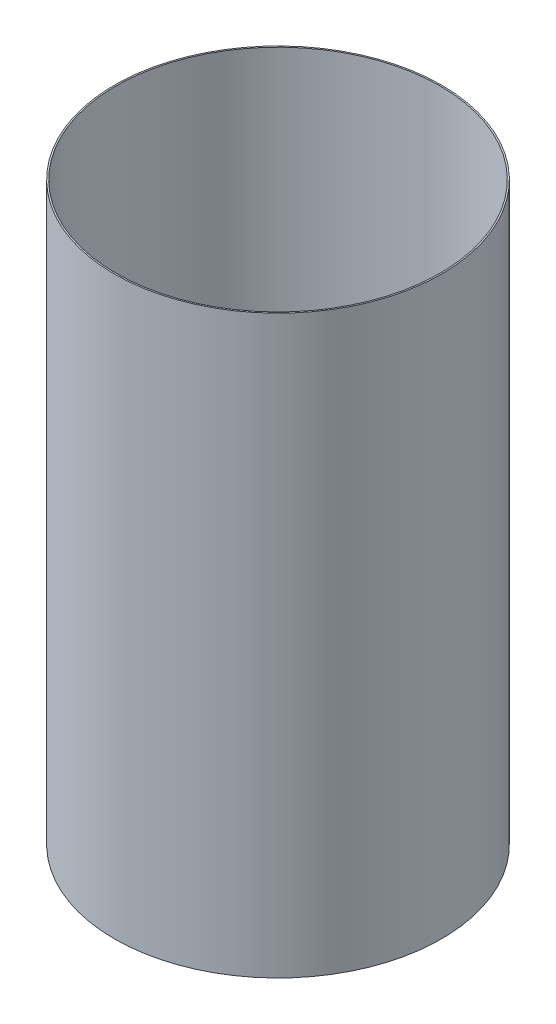
ISO-10303-21;
HEADER;
FILE_DESCRIPTION(('STEP AP214'),'2;1');
FILE_NAME('part.step','',(''),(''),'','','');
FILE_SCHEMA(('AUTOMOTIVE_DESIGN { 1 0 10303 214 1 1 1 1 }'));
ENDSEC;
DATA;
#1=APPLICATION_CONTEXT('core data for automotive mechanical design processes');
#2=APPLICATION_PROTOCOL_DEFINITION('international standard','automotive_design',2000,#1);
#3=PRODUCT_CONTEXT('',#1,'mechanical');
#4=PRODUCT('Part','Part','',(#3));
#5=PRODUCT_RELATED_PRODUCT_CATEGORY('part','',(#4));
#6=PRODUCT_DEFINITION_FORMATION('','',#4);
#7=PRODUCT_DEFINITION_CONTEXT('part definition',#1,'design');
#8=PRODUCT_DEFINITION('design','',#6,#7);
#9=PRODUCT_DEFINITION_SHAPE('','',#8);
#10=(LENGTH_UNIT() NAMED_UNIT(*) SI_UNIT(.MILLI.,.METRE.));
#11=(NAMED_UNIT(*) PLANE_ANGLE_UNIT() SI_UNIT($,.RADIAN.));
#12=(NAMED_UNIT(*) SI_UNIT($,.STERADIAN.) SOLID_ANGLE_UNIT());
#13=UNCERTAINTY_MEASURE_WITH_UNIT(LENGTH_MEASURE(1.E-05),#10,'distance_accuracy_value','');
#14=(GEOMETRIC_REPRESENTATION_CONTEXT(3) GLOBAL_UNCERTAINTY_ASSIGNED_CONTEXT((#13)) GLOBAL_UNIT_ASSIGNED_CONTEXT((#10,
#11,#12)) REPRESENTATION_CONTEXT('',''));
#15=CARTESIAN_POINT('',(0.,0.,0.));
#16=DIRECTION('',(0.,0.,1.));
#17=DIRECTION('',(1.,0.,0.));
#18=AXIS2_PLACEMENT_3D('',#15,#16,#17);
#19=CARTESIAN_POINT('',(0.,790.,0.));
#20=DIRECTION('',(0.,-1.,0.));
#21=DIRECTION('',(0.,0.,-1.));
#22=AXIS2_PLACEMENT_3D('',#19,#20,#21);
#23=CYLINDRICAL_SURFACE('',#22,224.5);
#24=CARTESIAN_POINT('',(0.,790.,0.));
#25=DIRECTION('',(0.,1.,0.));
#26=DIRECTION('',(0.,0.,1.));
#27=AXIS2_PLACEMENT_3D('',#24,#25,#26);
#28=CIRCLE('',#27,224.5);
#29=CARTESIAN_POINT('',(0.,790.,-224.5));
#30=VERTEX_POINT('',#29);
#31=EDGE_CURVE('E10',#30,#30,#28,.T.);
#32=CARTESIAN_POINT('',(0.,0.,0.));
#33=DIRECTION('',(0.,1.,0.));
#34=DIRECTION('',(0.,0.,1.));
#35=AXIS2_PLACEMENT_3D('',#32,#33,#34);
#36=CIRCLE('',#35,224.5);
#37=CARTESIAN_POINT('',(0.,-1.11022302462516E-13,-224.5));
#38=VERTEX_POINT('',#37);
#39=EDGE_CURVE('E35',#38,#38,#36,.T.);
#40=CARTESIAN_POINT('',(0.,790.,-224.5));
#41=CARTESIAN_POINT('',(0.,781.770833333333,-224.5));
#42=CARTESIAN_POINT('',(0.,773.541666666667,-224.5));
#43=CARTESIAN_POINT('',(0.,757.083333333333,-224.5));
#44=CARTESIAN_POINT('',(0.,748.854166666667,-224.5));
#45=CARTESIAN_POINT('',(0.,732.395833333333,-224.5));
#46=CARTESIAN_POINT('',(0.,724.166666666667,-224.5));
#47=CARTESIAN_POINT('',(0.,707.708333333333,-224.5));
#48=CARTESIAN_POINT('',(0.,699.479166666667,-224.5));
#49=CARTESIAN_POINT('',(0.,683.020833333333,-224.5));
#50=CARTESIAN_POINT('',(0.,674.791666666667,-224.5));
#51=CARTESIAN_POINT('',(0.,658.333333333333,-224.5));
#52=CARTESIAN_POINT('',(0.,650.104166666667,-224.5));
#53=CARTESIAN_POINT('',(0.,633.645833333333,-224.5));
#54=CARTESIAN_POINT('',(0.,625.416666666667,-224.5));
#55=CARTESIAN_POINT('',(0.,608.958333333333,-224.5));
#56=CARTESIAN_POINT('',(0.,600.729166666667,-224.5));
#57=CARTESIAN_POINT('',(0.,584.270833333333,-224.5));
#58=CARTESIAN_POINT('',(0.,576.041666666667,-224.5));
#59=CARTESIAN_POINT('',(0.,559.583333333333,-224.5));
#60=CARTESIAN_POINT('',(0.,551.354166666667,-224.5));
#61=CARTESIAN_POINT('',(0.,534.895833333333,-224.5));
#62=CARTESIAN_POINT('',(0.,526.666666666667,-224.5));
#63=CARTESIAN_POINT('',(0.,510.208333333333,-224.5));
#64=CARTESIAN_POINT('',(0.,501.979166666667,-224.5));
#65=CARTESIAN_POINT('',(0.,485.520833333333,-224.5));
#66=CARTESIAN_POINT('',(0.,477.291666666667,-224.5));
#67=CARTESIAN_POINT('',(0.,460.833333333333,-224.5));
#68=CARTESIAN_POINT('',(0.,452.604166666667,-224.5));
#69=CARTESIAN_POINT('',(0.,436.145833333333,-224.5));
#70=CARTESIAN_POINT('',(0.,427.916666666667,-224.5));
#71=CARTESIAN_POINT('',(0.,411.458333333333,-224.5));
#72=CARTESIAN_POINT('',(0.,403.229166666667,-224.5));
#73=CARTESIAN_POINT('',(0.,386.770833333333,-224.5));
#74=CARTESIAN_POINT('',(0.,378.541666666667,-224.5));
#75=CARTESIAN_POINT('',(0.,362.083333333333,-224.5));
#76=CARTESIAN_POINT('',(0.,353.854166666667,-224.5));
#77=CARTESIAN_POINT('',(0.,337.395833333333,-224.5));
#78=CARTESIAN_POINT('',(0.,329.166666666667,-224.5));
#79=CARTESIAN_POINT('',(0.,312.708333333333,-224.5));
#80=CARTESIAN_POINT('',(0.,304.479166666667,-224.5));
#81=CARTESIAN_POINT('',(0.,288.020833333333,-224.5));
#82=CARTESIAN_POINT('',(0.,279.791666666667,-224.5));
#83=CARTESIAN_POINT('',(0.,263.333333333333,-224.5));
#84=CARTESIAN_POINT('',(0.,255.104166666667,-224.5));
#85=CARTESIAN_POINT('',(0.,238.645833333333,-224.5));
#86=CARTESIAN_POINT('',(0.,230.416666666667,-224.5));
#87=CARTESIAN_POINT('',(0.,213.958333333333,-224.5));
#88=CARTESIAN_POINT('',(0.,205.729166666667,-224.5));
#89=CARTESIAN_POINT('',(0.,189.270833333333,-224.5));
#90=CARTESIAN_POINT('',(0.,181.041666666667,-224.5));
#91=CARTESIAN_POINT('',(0.,164.583333333333,-224.5));
#92=CARTESIAN_POINT('',(0.,156.354166666667,-224.5));
#93=CARTESIAN_POINT('',(0.,139.895833333333,-224.5));
#94=CARTESIAN_POINT('',(0.,131.666666666667,-224.5));
#95=CARTESIAN_POINT('',(0.,115.208333333333,-224.5));
#96=CARTESIAN_POINT('',(0.,106.979166666667,-224.5));
#97=CARTESIAN_POINT('',(0.,90.5208333333332,-224.5));
#98=CARTESIAN_POINT('',(0.,82.2916666666666,-224.5));
#99=CARTESIAN_POINT('',(0.,65.8333333333333,-224.5));
#100=CARTESIAN_POINT('',(0.,57.6041666666666,-224.5));
#101=CARTESIAN_POINT('',(0.,41.1458333333333,-224.5));
#102=CARTESIAN_POINT('',(0.,32.9166666666666,-224.5));
#103=CARTESIAN_POINT('',(0.,16.4583333333332,-224.5));
#104=CARTESIAN_POINT('',(0.,8.22916666666655,-224.5));
#105=CARTESIAN_POINT('',(0.,-1.11022302462516E-13,-224.5));
#106=B_SPLINE_CURVE_WITH_KNOTS('',3,(#40,#41,#42,#43,#44,#45,#46,#47,#48,#49,#50,#51,#52,#53,
#54,#55,#56,#57,#58,#59,#60,#61,#62,#63,#64,#65,#66,#67,#68,#69,#70,#71,#72,#73,#74,#75,#76,#77,
#78,#79,#80,#81,#82,#83,#84,#85,#86,#87,#88,#89,#90,#91,#92,#93,#94,#95,#96,#97,#98,#99,#100,
#101,#102,#103,#104,#105),.UNSPECIFIED.,.F.,.F.,(4,2,2,2,2,2,2,2,2,2,2,2,2,2,2,2,2,2,2,2,2,2,2,
2,2,2,2,2,2,2,2,2,4),(0.,24.6875000000001,49.3750000000001,74.0625,98.7500000000001,123.4375,
148.125,172.8125,197.5,222.1875,246.875,271.5625,296.25,320.9375,345.625,370.3125,395.,419.6875,
444.375,469.0625,493.75,518.4375,543.125,567.8125,592.5,617.1875,641.875,666.5625,691.25,
715.9375,740.625,765.3125,790.),.UNSPECIFIED.);
#107=EDGE_CURVE('BSEAM32',#30,#38,#106,.T.);
#108=ORIENTED_EDGE('',*,*,#31,.F.);
#109=ORIENTED_EDGE('',*,*,#39,.T.);
#110=ORIENTED_EDGE('',*,*,#107,.T.);
#111=ORIENTED_EDGE('',*,*,#107,.F.);
#112=EDGE_LOOP('',(#108,#110,#109,#111));
#113=FACE_BOUND('',#112,.T.);
#114=ADVANCED_FACE('F32',(#113),#23,.T.);
#115=CARTESIAN_POINT('',(0.,790.,0.));
#116=DIRECTION('',(0.,1.,0.));
#117=DIRECTION('',(0.,0.,1.));
#118=AXIS2_PLACEMENT_3D('',#115,#116,#117);
#119=PLANE('',#118);
#120=CARTESIAN_POINT('',(0.,790.,0.));
#121=DIRECTION('',(0.,1.,0.));
#122=DIRECTION('',(0.,0.,1.));
#123=AXIS2_PLACEMENT_3D('',#120,#121,#122);
#124=CIRCLE('',#123,222.5);
#125=CARTESIAN_POINT('',(0.,790.,-222.5));
#126=VERTEX_POINT('',#125);
#127=EDGE_CURVE('E42',#126,#126,#124,.T.);
#128=ORIENTED_EDGE('',*,*,#127,.F.);
#129=EDGE_LOOP('',(#128));
#130=FACE_BOUND('',#129,.T.);
#131=ORIENTED_EDGE('',*,*,#31,.T.);
#132=EDGE_LOOP('',(#131));
#133=FACE_BOUND('',#132,.T.);
#134=ADVANCED_FACE('F53',(#130,#133),#119,.T.);
#135=CARTESIAN_POINT('',(0.,0.,0.));
#136=DIRECTION('',(0.,1.,0.));
#137=DIRECTION('',(0.,0.,1.));
#138=AXIS2_PLACEMENT_3D('',#135,#136,#137);
#139=PLANE('',#138);
#140=CARTESIAN_POINT('',(0.,0.,0.));
#141=DIRECTION('',(0.,1.,0.));
#142=DIRECTION('',(0.,0.,1.));
#143=AXIS2_PLACEMENT_3D('',#140,#141,#142);
#144=CIRCLE('',#143,222.5);
#145=CARTESIAN_POINT('',(0.,-1.11022302462516E-13,-222.5));
#146=VERTEX_POINT('',#145);
#147=EDGE_CURVE('E44',#146,#146,#144,.T.);
#148=ORIENTED_EDGE('',*,*,#147,.T.);
#149=EDGE_LOOP('',(#148));
#150=FACE_BOUND('',#149,.T.);
#151=ORIENTED_EDGE('',*,*,#39,.F.);
#152=EDGE_LOOP('',(#151));
#153=FACE_BOUND('',#152,.T.);
#154=ADVANCED_FACE('F55',(#150,#153),#139,.F.);
#155=CARTESIAN_POINT('',(0.,790.,0.));
#156=DIRECTION('',(0.,-1.,0.));
#157=DIRECTION('',(0.,0.,-1.));
#158=AXIS2_PLACEMENT_3D('',#155,#156,#157);
#159=CYLINDRICAL_SURFACE('',#158,222.5);
#160=CARTESIAN_POINT('',(0.,790.,-222.5));
#161=CARTESIAN_POINT('',(0.,781.770833333333,-222.5));
#162=CARTESIAN_POINT('',(0.,773.541666666667,-222.5));
#163=CARTESIAN_POINT('',(0.,757.083333333333,-222.5));
#164=CARTESIAN_POINT('',(0.,748.854166666667,-222.5));
#165=CARTESIAN_POINT('',(0.,732.395833333333,-222.5));
#166=CARTESIAN_POINT('',(0.,724.166666666667,-222.5));
#167=CARTESIAN_POINT('',(0.,707.708333333333,-222.5));
#168=CARTESIAN_POINT('',(0.,699.479166666667,-222.5));
#169=CARTESIAN_POINT('',(0.,683.020833333333,-222.5));
#170=CARTESIAN_POINT('',(0.,674.791666666667,-222.5));
#171=CARTESIAN_POINT('',(0.,658.333333333333,-222.5));
#172=CARTESIAN_POINT('',(0.,650.104166666667,-222.5));
#173=CARTESIAN_POINT('',(0.,633.645833333333,-222.5));
#174=CARTESIAN_POINT('',(0.,625.416666666667,-222.5));
#175=CARTESIAN_POINT('',(0.,608.958333333333,-222.5));
#176=CARTESIAN_POINT('',(0.,600.729166666667,-222.5));
#177=CARTESIAN_POINT('',(0.,584.270833333333,-222.5));
#178=CARTESIAN_POINT('',(0.,576.041666666667,-222.5));
#179=CARTESIAN_POINT('',(0.,559.583333333333,-222.5));
#180=CARTESIAN_POINT('',(0.,551.354166666667,-222.5));
#181=CARTESIAN_POINT('',(0.,534.895833333333,-222.5));
#182=CARTESIAN_POINT('',(0.,526.666666666667,-222.5));
#183=CARTESIAN_POINT('',(0.,510.208333333333,-222.5));
#184=CARTESIAN_POINT('',(0.,501.979166666667,-222.5));
#185=CARTESIAN_POINT('',(0.,485.520833333333,-222.5));
#186=CARTESIAN_POINT('',(0.,477.291666666667,-222.5));
#187=CARTESIAN_POINT('',(0.,460.833333333333,-222.5));
#188=CARTESIAN_POINT('',(0.,452.604166666667,-222.5));
#189=CARTESIAN_POINT('',(0.,436.145833333333,-222.5));
#190=CARTESIAN_POINT('',(0.,427.916666666667,-222.5));
#191=CARTESIAN_POINT('',(0.,411.458333333333,-222.5));
#192=CARTESIAN_POINT('',(0.,403.229166666667,-222.5));
#193=CARTESIAN_POINT('',(0.,386.770833333333,-222.5));
#194=CARTESIAN_POINT('',(0.,378.541666666667,-222.5));
#195=CARTESIAN_POINT('',(0.,362.083333333333,-222.5));
#196=CARTESIAN_POINT('',(0.,353.854166666667,-222.5));
#197=CARTESIAN_POINT('',(0.,337.395833333333,-222.5));
#198=CARTESIAN_POINT('',(0.,329.166666666667,-222.5));
#199=CARTESIAN_POINT('',(0.,312.708333333333,-222.5));
#200=CARTESIAN_POINT('',(0.,304.479166666667,-222.5));
#201=CARTESIAN_POINT('',(0.,288.020833333333,-222.5));
#202=CARTESIAN_POINT('',(0.,279.791666666667,-222.5));
#203=CARTESIAN_POINT('',(0.,263.333333333333,-222.5));
#204=CARTESIAN_POINT('',(0.,255.104166666667,-222.5));
#205=CARTESIAN_POINT('',(0.,238.645833333333,-222.5));
#206=CARTESIAN_POINT('',(0.,230.416666666667,-222.5));
#207=CARTESIAN_POINT('',(0.,213.958333333333,-222.5));
#208=CARTESIAN_POINT('',(0.,205.729166666667,-222.5));
#209=CARTESIAN_POINT('',(0.,189.270833333333,-222.5));
#210=CARTESIAN_POINT('',(0.,181.041666666667,-222.5));
#211=CARTESIAN_POINT('',(0.,164.583333333333,-222.5));
#212=CARTESIAN_POINT('',(0.,156.354166666667,-222.5));
#213=CARTESIAN_POINT('',(0.,139.895833333333,-222.5));
#214=CARTESIAN_POINT('',(0.,131.666666666667,-222.5));
#215=CARTESIAN_POINT('',(0.,115.208333333333,-222.5));
#216=CARTESIAN_POINT('',(0.,106.979166666667,-222.5));
#217=CARTESIAN_POINT('',(0.,90.5208333333332,-222.5));
#218=CARTESIAN_POINT('',(0.,82.2916666666666,-222.5));
#219=CARTESIAN_POINT('',(0.,65.8333333333333,-222.5));
#220=CARTESIAN_POINT('',(0.,57.6041666666666,-222.5));
#221=CARTESIAN_POINT('',(0.,41.1458333333333,-222.5));
#222=CARTESIAN_POINT('',(0.,32.9166666666666,-222.5));
#223=CARTESIAN_POINT('',(0.,16.4583333333332,-222.5));
#224=CARTESIAN_POINT('',(0.,8.22916666666655,-222.5));
#225=CARTESIAN_POINT('',(0.,-1.11022302462516E-13,-222.5));
#226=B_SPLINE_CURVE_WITH_KNOTS('',3,(#160,#161,#162,#163,#164,#165,#166,#167,#168,#169,#170,
#171,#172,#173,#174,#175,#176,#177,#178,#179,#180,#181,#182,#183,#184,#185,#186,#187,#188,#189,
#190,#191,#192,#193,#194,#195,#196,#197,#198,#199,#200,#201,#202,#203,#204,#205,#206,#207,#208,
#209,#210,#211,#212,#213,#214,#215,#216,#217,#218,#219,#220,#221,#222,#223,#224,#225),
.UNSPECIFIED.,.F.,.F.,(4,2,2,2,2,2,2,2,2,2,2,2,2,2,2,2,2,2,2,2,2,2,2,2,2,2,2,2,2,2,2,2,4),(0.,
24.6875,49.3749999999999,74.0624999999999,98.75,123.4375,148.125,172.8125,197.5,222.1875,
246.875,271.5625,296.25,320.9375,345.625,370.3125,395.,419.6875,444.375,469.0625,493.75,
518.4375,543.125,567.8125,592.5,617.1875,641.875,666.5625,691.25,715.9375,740.625,765.3125,
790.),.UNSPECIFIED.);
#227=EDGE_CURVE('BSEAM50',#126,#146,#226,.T.);
#228=ORIENTED_EDGE('',*,*,#127,.T.);
#229=ORIENTED_EDGE('',*,*,#147,.F.);
#230=ORIENTED_EDGE('',*,*,#227,.T.);
#231=ORIENTED_EDGE('',*,*,#227,.F.);
#232=EDGE_LOOP('',(#228,#230,#229,#231));
#233=FACE_BOUND('',#232,.T.);
#234=ADVANCED_FACE('F50',(#233),#159,.F.);
#235=CLOSED_SHELL('',(#114,#134,#154,#234));
#236=MANIFOLD_SOLID_BREP('B2',#235);
#237=ADVANCED_BREP_SHAPE_REPRESENTATION('',(#18,#236),#14);
#238=SHAPE_DEFINITION_REPRESENTATION(#9,#237);
ENDSEC;
END-ISO-10303-21;
